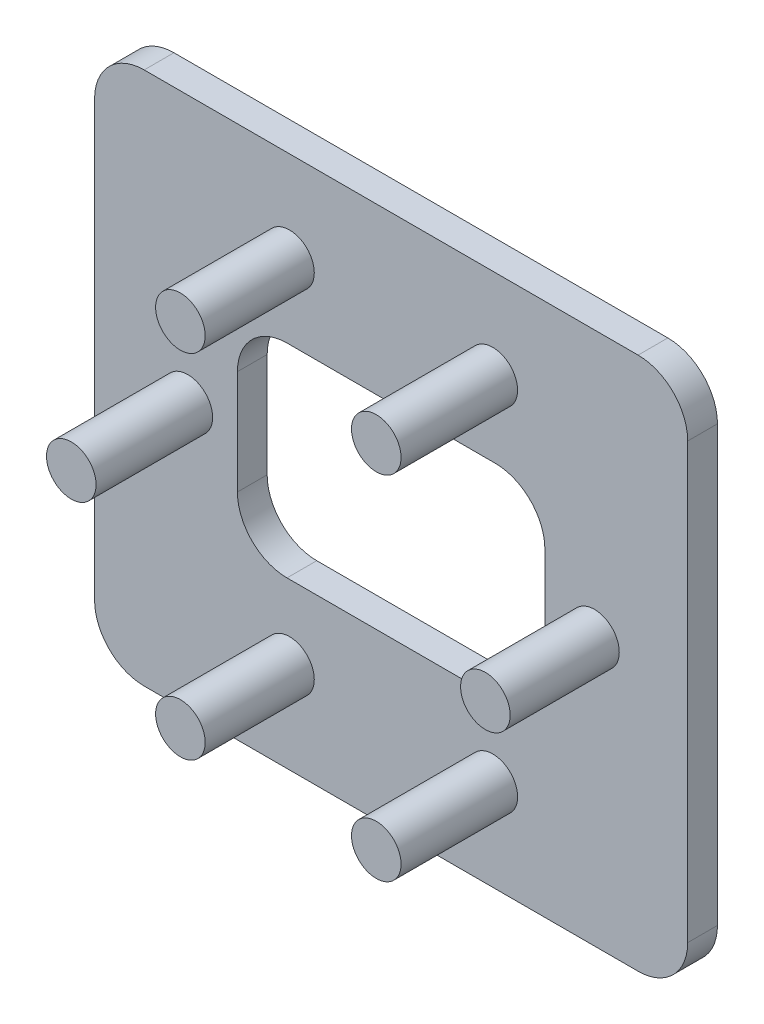
ISO-10303-21;
HEADER;
FILE_DESCRIPTION(('STEP AP214'),'2;1');
FILE_NAME('part.step','',(''),(''),'','','');
FILE_SCHEMA(('AUTOMOTIVE_DESIGN { 1 0 10303 214 1 1 1 1 }'));
ENDSEC;
DATA;
#1=APPLICATION_CONTEXT('core data for automotive mechanical design processes');
#2=APPLICATION_PROTOCOL_DEFINITION('international standard','automotive_design',2000,#1);
#3=PRODUCT_CONTEXT('',#1,'mechanical');
#4=PRODUCT('Part','Part','',(#3));
#5=PRODUCT_RELATED_PRODUCT_CATEGORY('part','',(#4));
#6=PRODUCT_DEFINITION_FORMATION('','',#4);
#7=PRODUCT_DEFINITION_CONTEXT('part definition',#1,'design');
#8=PRODUCT_DEFINITION('design','',#6,#7);
#9=PRODUCT_DEFINITION_SHAPE('','',#8);
#10=(LENGTH_UNIT() NAMED_UNIT(*) SI_UNIT(.MILLI.,.METRE.));
#11=(NAMED_UNIT(*) PLANE_ANGLE_UNIT() SI_UNIT($,.RADIAN.));
#12=(NAMED_UNIT(*) SI_UNIT($,.STERADIAN.) SOLID_ANGLE_UNIT());
#13=UNCERTAINTY_MEASURE_WITH_UNIT(LENGTH_MEASURE(1.E-05),#10,'distance_accuracy_value','');
#14=(GEOMETRIC_REPRESENTATION_CONTEXT(3) GLOBAL_UNCERTAINTY_ASSIGNED_CONTEXT((#13)) GLOBAL_UNIT_ASSIGNED_CONTEXT((#10,
#11,#12)) REPRESENTATION_CONTEXT('',''));
#15=CARTESIAN_POINT('',(0.,0.,0.));
#16=DIRECTION('',(0.,0.,1.));
#17=DIRECTION('',(1.,0.,0.));
#18=AXIS2_PLACEMENT_3D('',#15,#16,#17);
#19=CARTESIAN_POINT('',(-10.2500000000001,-17.7535207775809,14.));
#20=DIRECTION('',(0.,0.,-1.));
#21=DIRECTION('',(-1.,0.,0.));
#22=AXIS2_PLACEMENT_3D('',#19,#20,#21);
#23=CYLINDRICAL_SURFACE('',#22,2.5);
#24=CARTESIAN_POINT('',(-10.2500000000001,-17.7535207775809,14.));
#25=DIRECTION('',(0.,0.,1.));
#26=DIRECTION('',(1.,0.,0.));
#27=AXIS2_PLACEMENT_3D('',#24,#25,#26);
#28=CIRCLE('',#27,2.5);
#29=CARTESIAN_POINT('',(-7.75000000000009,-17.7535207775809,14.));
#30=VERTEX_POINT('',#29);
#31=EDGE_CURVE('E196',#30,#30,#28,.T.);
#32=ORIENTED_EDGE('',*,*,#31,.F.);
#33=EDGE_LOOP('',(#32));
#34=FACE_BOUND('',#33,.T.);
#35=CARTESIAN_POINT('',(-10.2500000000001,-17.7535207775809,0.));
#36=DIRECTION('',(0.,0.,1.));
#37=DIRECTION('',(1.,0.,0.));
#38=AXIS2_PLACEMENT_3D('',#35,#36,#37);
#39=CIRCLE('',#38,2.5);
#40=CARTESIAN_POINT('',(-7.75000000000009,-17.7535207775809,0.));
#41=VERTEX_POINT('',#40);
#42=EDGE_CURVE('E12',#41,#41,#39,.T.);
#43=ORIENTED_EDGE('',*,*,#42,.T.);
#44=EDGE_LOOP('',(#43));
#45=FACE_BOUND('',#44,.T.);
#46=ADVANCED_FACE('F192',(#34,#45),#23,.T.);
#47=CARTESIAN_POINT('',(-10.2500000000001,-17.7535207775809,14.));
#48=DIRECTION('',(0.,0.,1.));
#49=DIRECTION('',(1.,0.,0.));
#50=AXIS2_PLACEMENT_3D('',#47,#48,#49);
#51=PLANE('',#50);
#52=ORIENTED_EDGE('',*,*,#31,.T.);
#53=EDGE_LOOP('',(#52));
#54=FACE_BOUND('',#53,.T.);
#55=ADVANCED_FACE('F194',(#54),#51,.T.);
#56=CARTESIAN_POINT('',(-10.2500000000001,-17.7535207775809,0.));
#57=DIRECTION('',(0.,0.,1.));
#58=DIRECTION('',(1.,0.,0.));
#59=AXIS2_PLACEMENT_3D('',#56,#57,#58);
#60=PLANE('',#59);
#61=ORIENTED_EDGE('',*,*,#42,.F.);
#62=EDGE_LOOP('',(#61));
#63=FACE_BOUND('',#62,.T.);
#64=ADVANCED_FACE('F211',(#63),#60,.F.);
#65=CLOSED_SHELL('',(#46,#55,#64));
#66=MANIFOLD_SOLID_BREP('B2',#65);
#67=CARTESIAN_POINT('',(10.2500000000001,17.7535207775809,14.));
#68=DIRECTION('',(0.,0.,-1.));
#69=DIRECTION('',(-1.,0.,0.));
#70=AXIS2_PLACEMENT_3D('',#67,#68,#69);
#71=CYLINDRICAL_SURFACE('',#70,2.5);
#72=CARTESIAN_POINT('',(10.2500000000001,17.7535207775809,14.75));
#73=DIRECTION('',(0.,0.,1.));
#74=DIRECTION('',(1.,0.,0.));
#75=AXIS2_PLACEMENT_3D('',#72,#73,#74);
#76=CIRCLE('',#75,2.5);
#77=CARTESIAN_POINT('',(12.7500000000001,17.7535207775809,14.75));
#78=VERTEX_POINT('',#77);
#79=EDGE_CURVE('E254',#78,#78,#76,.T.);
#80=ORIENTED_EDGE('',*,*,#79,.F.);
#81=EDGE_LOOP('',(#80));
#82=FACE_BOUND('',#81,.T.);
#83=CARTESIAN_POINT('',(10.2500000000001,17.7535207775809,0.));
#84=DIRECTION('',(0.,0.,1.));
#85=DIRECTION('',(1.,0.,0.));
#86=AXIS2_PLACEMENT_3D('',#83,#84,#85);
#87=CIRCLE('',#86,2.5);
#88=CARTESIAN_POINT('',(12.7500000000001,17.7535207775809,0.));
#89=VERTEX_POINT('',#88);
#90=EDGE_CURVE('E191',#89,#89,#87,.T.);
#91=ORIENTED_EDGE('',*,*,#90,.T.);
#92=EDGE_LOOP('',(#91));
#93=FACE_BOUND('',#92,.T.);
#94=ADVANCED_FACE('F247',(#82,#93),#71,.T.);
#95=CARTESIAN_POINT('',(10.2500000000001,17.7535207775809,0.));
#96=DIRECTION('',(0.,0.,1.));
#97=DIRECTION('',(1.,0.,0.));
#98=AXIS2_PLACEMENT_3D('',#95,#96,#97);
#99=PLANE('',#98);
#100=ORIENTED_EDGE('',*,*,#90,.F.);
#101=EDGE_LOOP('',(#100));
#102=FACE_BOUND('',#101,.T.);
#103=ADVANCED_FACE('F249',(#102),#99,.F.);
#104=CARTESIAN_POINT('',(10.2500000000001,17.7535207775809,14.75));
#105=DIRECTION('',(0.,0.,1.));
#106=DIRECTION('',(1.,0.,0.));
#107=AXIS2_PLACEMENT_3D('',#104,#105,#106);
#108=PLANE('',#107);
#109=ORIENTED_EDGE('',*,*,#79,.T.);
#110=EDGE_LOOP('',(#109));
#111=FACE_BOUND('',#110,.T.);
#112=ADVANCED_FACE('F260',(#111),#108,.T.);
#113=CLOSED_SHELL('',(#94,#103,#112));
#114=MANIFOLD_SOLID_BREP('B7',#113);
#115=CARTESIAN_POINT('',(-10.2499999999998,17.7535207775811,14.));
#116=DIRECTION('',(0.,0.,-1.));
#117=DIRECTION('',(-1.,0.,0.));
#118=AXIS2_PLACEMENT_3D('',#115,#116,#117);
#119=CYLINDRICAL_SURFACE('',#118,2.5);
#120=CARTESIAN_POINT('',(-10.2499999999998,17.7535207775811,14.));
#121=DIRECTION('',(0.,0.,1.));
#122=DIRECTION('',(1.,0.,0.));
#123=AXIS2_PLACEMENT_3D('',#120,#121,#122);
#124=CIRCLE('',#123,2.5);
#125=CARTESIAN_POINT('',(-7.74999999999984,17.7535207775811,14.));
#126=VERTEX_POINT('',#125);
#127=EDGE_CURVE('E309',#126,#126,#124,.T.);
#128=ORIENTED_EDGE('',*,*,#127,.F.);
#129=EDGE_LOOP('',(#128));
#130=FACE_BOUND('',#129,.T.);
#131=CARTESIAN_POINT('',(-10.2499999999998,17.7535207775811,0.));
#132=DIRECTION('',(0.,0.,1.));
#133=DIRECTION('',(1.,0.,0.));
#134=AXIS2_PLACEMENT_3D('',#131,#132,#133);
#135=CIRCLE('',#134,2.5);
#136=CARTESIAN_POINT('',(-7.74999999999984,17.7535207775811,0.));
#137=VERTEX_POINT('',#136);
#138=EDGE_CURVE('E246',#137,#137,#135,.T.);
#139=ORIENTED_EDGE('',*,*,#138,.T.);
#140=EDGE_LOOP('',(#139));
#141=FACE_BOUND('',#140,.T.);
#142=ADVANCED_FACE('F305',(#130,#141),#119,.T.);
#143=CARTESIAN_POINT('',(-10.2499999999998,17.7535207775811,14.));
#144=DIRECTION('',(0.,0.,1.));
#145=DIRECTION('',(1.,0.,0.));
#146=AXIS2_PLACEMENT_3D('',#143,#144,#145);
#147=PLANE('',#146);
#148=ORIENTED_EDGE('',*,*,#127,.T.);
#149=EDGE_LOOP('',(#148));
#150=FACE_BOUND('',#149,.T.);
#151=ADVANCED_FACE('F307',(#150),#147,.T.);
#152=CARTESIAN_POINT('',(-10.2499999999998,17.7535207775811,0.));
#153=DIRECTION('',(0.,0.,1.));
#154=DIRECTION('',(1.,0.,0.));
#155=AXIS2_PLACEMENT_3D('',#152,#153,#154);
#156=PLANE('',#155);
#157=ORIENTED_EDGE('',*,*,#138,.F.);
#158=EDGE_LOOP('',(#157));
#159=FACE_BOUND('',#158,.T.);
#160=ADVANCED_FACE('F324',(#159),#156,.F.);
#161=CLOSED_SHELL('',(#142,#151,#160));
#162=MANIFOLD_SOLID_BREP('B186',#161);
#163=CARTESIAN_POINT('',(20.5,0.,14.));
#164=DIRECTION('',(0.,0.,-1.));
#165=DIRECTION('',(-1.,0.,0.));
#166=AXIS2_PLACEMENT_3D('',#163,#164,#165);
#167=CYLINDRICAL_SURFACE('',#166,2.5);
#168=CARTESIAN_POINT('',(20.5,0.,14.));
#169=DIRECTION('',(0.,0.,1.));
#170=DIRECTION('',(1.,0.,0.));
#171=AXIS2_PLACEMENT_3D('',#168,#169,#170);
#172=CIRCLE('',#171,2.5);
#173=CARTESIAN_POINT('',(23.,0.,14.));
#174=VERTEX_POINT('',#173);
#175=EDGE_CURVE('E364',#174,#174,#172,.T.);
#176=ORIENTED_EDGE('',*,*,#175,.F.);
#177=EDGE_LOOP('',(#176));
#178=FACE_BOUND('',#177,.T.);
#179=CARTESIAN_POINT('',(20.5,0.,0.));
#180=DIRECTION('',(0.,0.,1.));
#181=DIRECTION('',(1.,0.,0.));
#182=AXIS2_PLACEMENT_3D('',#179,#180,#181);
#183=CIRCLE('',#182,2.5);
#184=CARTESIAN_POINT('',(23.,0.,0.));
#185=VERTEX_POINT('',#184);
#186=EDGE_CURVE('E304',#185,#185,#183,.T.);
#187=ORIENTED_EDGE('',*,*,#186,.T.);
#188=EDGE_LOOP('',(#187));
#189=FACE_BOUND('',#188,.T.);
#190=ADVANCED_FACE('F360',(#178,#189),#167,.T.);
#191=CARTESIAN_POINT('',(0.,0.,14.));
#192=DIRECTION('',(0.,0.,1.));
#193=DIRECTION('',(1.,0.,0.));
#194=AXIS2_PLACEMENT_3D('',#191,#192,#193);
#195=PLANE('',#194);
#196=ORIENTED_EDGE('',*,*,#175,.T.);
#197=EDGE_LOOP('',(#196));
#198=FACE_BOUND('',#197,.T.);
#199=ADVANCED_FACE('F362',(#198),#195,.T.);
#200=CARTESIAN_POINT('',(0.,0.,0.));
#201=DIRECTION('',(0.,0.,1.));
#202=DIRECTION('',(1.,0.,0.));
#203=AXIS2_PLACEMENT_3D('',#200,#201,#202);
#204=PLANE('',#203);
#205=ORIENTED_EDGE('',*,*,#186,.F.);
#206=EDGE_LOOP('',(#205));
#207=FACE_BOUND('',#206,.T.);
#208=ADVANCED_FACE('F379',(#207),#204,.F.);
#209=CLOSED_SHELL('',(#190,#199,#208));
#210=MANIFOLD_SOLID_BREP('B241',#209);
#211=CARTESIAN_POINT('',(10.25,-17.7535207775811,14.));
#212=DIRECTION('',(0.,0.,-1.));
#213=DIRECTION('',(-1.,0.,0.));
#214=AXIS2_PLACEMENT_3D('',#211,#212,#213);
#215=CYLINDRICAL_SURFACE('',#214,2.50000000000007);
#216=CARTESIAN_POINT('',(10.25,-17.7535207775811,14.75));
#217=DIRECTION('',(0.,0.,1.));
#218=DIRECTION('',(1.,0.,0.));
#219=AXIS2_PLACEMENT_3D('',#216,#217,#218);
#220=CIRCLE('',#219,2.50000000000008);
#221=CARTESIAN_POINT('',(12.75,-17.7535207775811,14.75));
#222=VERTEX_POINT('',#221);
#223=EDGE_CURVE('E422',#222,#222,#220,.T.);
#224=ORIENTED_EDGE('',*,*,#223,.F.);
#225=EDGE_LOOP('',(#224));
#226=FACE_BOUND('',#225,.T.);
#227=CARTESIAN_POINT('',(10.25,-17.7535207775811,0.));
#228=DIRECTION('',(0.,0.,1.));
#229=DIRECTION('',(1.,0.,0.));
#230=AXIS2_PLACEMENT_3D('',#227,#228,#229);
#231=CIRCLE('',#230,2.50000000000007);
#232=CARTESIAN_POINT('',(12.75,-17.7535207775811,0.));
#233=VERTEX_POINT('',#232);
#234=EDGE_CURVE('E359',#233,#233,#231,.T.);
#235=ORIENTED_EDGE('',*,*,#234,.T.);
#236=EDGE_LOOP('',(#235));
#237=FACE_BOUND('',#236,.T.);
#238=ADVANCED_FACE('F415',(#226,#237),#215,.T.);
#239=CARTESIAN_POINT('',(0.,0.,0.));
#240=DIRECTION('',(0.,0.,1.));
#241=DIRECTION('',(1.,0.,0.));
#242=AXIS2_PLACEMENT_3D('',#239,#240,#241);
#243=PLANE('',#242);
#244=ORIENTED_EDGE('',*,*,#234,.F.);
#245=EDGE_LOOP('',(#244));
#246=FACE_BOUND('',#245,.T.);
#247=ADVANCED_FACE('F417',(#246),#243,.F.);
#248=CARTESIAN_POINT('',(10.25,-17.7535207775811,14.75));
#249=DIRECTION('',(0.,0.,1.));
#250=DIRECTION('',(1.,0.,0.));
#251=AXIS2_PLACEMENT_3D('',#248,#249,#250);
#252=PLANE('',#251);
#253=ORIENTED_EDGE('',*,*,#223,.T.);
#254=EDGE_LOOP('',(#253));
#255=FACE_BOUND('',#254,.T.);
#256=ADVANCED_FACE('F428',(#255),#252,.T.);
#257=CLOSED_SHELL('',(#238,#247,#256));
#258=MANIFOLD_SOLID_BREP('B299',#257);
#259=CARTESIAN_POINT('',(-20.5,0.,14.));
#260=DIRECTION('',(0.,0.,-1.));
#261=DIRECTION('',(-1.,0.,0.));
#262=AXIS2_PLACEMENT_3D('',#259,#260,#261);
#263=CYLINDRICAL_SURFACE('',#262,2.5);
#264=CARTESIAN_POINT('',(-20.5,0.,14.75));
#265=DIRECTION('',(0.,0.,1.));
#266=DIRECTION('',(1.,0.,0.));
#267=AXIS2_PLACEMENT_3D('',#264,#265,#266);
#268=CIRCLE('',#267,2.5);
#269=CARTESIAN_POINT('',(-18.,0.,14.75));
#270=VERTEX_POINT('',#269);
#271=EDGE_CURVE('E480',#270,#270,#268,.T.);
#272=ORIENTED_EDGE('',*,*,#271,.F.);
#273=EDGE_LOOP('',(#272));
#274=FACE_BOUND('',#273,.T.);
#275=CARTESIAN_POINT('',(-20.5,0.,0.));
#276=DIRECTION('',(0.,0.,1.));
#277=DIRECTION('',(1.,0.,0.));
#278=AXIS2_PLACEMENT_3D('',#275,#276,#277);
#279=CIRCLE('',#278,2.5);
#280=CARTESIAN_POINT('',(-18.,0.,0.));
#281=VERTEX_POINT('',#280);
#282=EDGE_CURVE('E414',#281,#281,#279,.T.);
#283=ORIENTED_EDGE('',*,*,#282,.T.);
#284=EDGE_LOOP('',(#283));
#285=FACE_BOUND('',#284,.T.);
#286=ADVANCED_FACE('F474',(#274,#285),#263,.T.);
#287=CARTESIAN_POINT('',(0.,0.,0.));
#288=DIRECTION('',(0.,0.,1.));
#289=DIRECTION('',(1.,0.,0.));
#290=AXIS2_PLACEMENT_3D('',#287,#288,#289);
#291=PLANE('',#290);
#292=ORIENTED_EDGE('',*,*,#282,.F.);
#293=EDGE_LOOP('',(#292));
#294=FACE_BOUND('',#293,.T.);
#295=ADVANCED_FACE('F489',(#294),#291,.F.);
#296=CARTESIAN_POINT('',(-20.5,0.,14.75));
#297=DIRECTION('',(0.,0.,1.));
#298=DIRECTION('',(1.,0.,0.));
#299=AXIS2_PLACEMENT_3D('',#296,#297,#298);
#300=PLANE('',#299);
#301=ORIENTED_EDGE('',*,*,#271,.T.);
#302=EDGE_LOOP('',(#301));
#303=FACE_BOUND('',#302,.T.);
#304=ADVANCED_FACE('F486',(#303),#300,.T.);
#305=CLOSED_SHELL('',(#286,#295,#304));
#306=MANIFOLD_SOLID_BREP('B354',#305);
#307=CARTESIAN_POINT('',(-29.9,-26.9,3.));
#308=DIRECTION('',(0.,1.,0.));
#309=DIRECTION('',(0.,0.,1.));
#310=AXIS2_PLACEMENT_3D('',#307,#308,#309);
#311=PLANE('',#310);
#312=DIRECTION('',(0.,0.,-1.));
#313=VECTOR('',#312,1.);
#314=CARTESIAN_POINT('',(24.9,-26.9,14.75));
#315=LINE('',#314,#313);
#316=CARTESIAN_POINT('',(24.9,-26.9,3.));
#317=VERTEX_POINT('',#316);
#318=CARTESIAN_POINT('',(24.9,-26.9,0.));
#319=VERTEX_POINT('',#318);
#320=EDGE_CURVE('E637',#317,#319,#315,.T.);
#321=ORIENTED_EDGE('',*,*,#320,.F.);
#322=DIRECTION('',(1.,0.,0.));
#323=VECTOR('',#322,1.);
#324=CARTESIAN_POINT('',(-29.9,-26.9,3.));
#325=LINE('',#324,#323);
#326=CARTESIAN_POINT('',(-24.9,-26.9,3.));
#327=VERTEX_POINT('',#326);
#328=EDGE_CURVE('E665',#327,#317,#325,.T.);
#329=ORIENTED_EDGE('',*,*,#328,.F.);
#330=DIRECTION('',(0.,0.,-1.));
#331=VECTOR('',#330,1.);
#332=CARTESIAN_POINT('',(-24.9,-26.9,14.75));
#333=LINE('',#332,#331);
#334=CARTESIAN_POINT('',(-24.9,-26.9,0.));
#335=VERTEX_POINT('',#334);
#336=EDGE_CURVE('E662',#335,#327,#333,.F.);
#337=ORIENTED_EDGE('',*,*,#336,.F.);
#338=DIRECTION('',(1.,0.,0.));
#339=VECTOR('',#338,1.);
#340=CARTESIAN_POINT('',(-29.9,-26.9,0.));
#341=LINE('',#340,#339);
#342=EDGE_CURVE('E656',#335,#319,#341,.T.);
#343=ORIENTED_EDGE('',*,*,#342,.T.);
#344=EDGE_LOOP('',(#321,#329,#337,#343));
#345=FACE_BOUND('',#344,.T.);
#346=ADVANCED_FACE('F524',(#345),#311,.F.);
#347=CARTESIAN_POINT('',(10.5,5.25352077758109,3.));
#348=DIRECTION('',(0.,0.,-1.));
#349=DIRECTION('',(-1.,0.,0.));
#350=AXIS2_PLACEMENT_3D('',#347,#348,#349);
#351=CYLINDRICAL_SURFACE('',#350,5.);
#352=CARTESIAN_POINT('',(10.5,5.25352077758109,0.));
#353=DIRECTION('',(0.,0.,1.));
#354=DIRECTION('',(1.,0.,0.));
#355=AXIS2_PLACEMENT_3D('',#352,#353,#354);
#356=CIRCLE('',#355,5.);
#357=CARTESIAN_POINT('',(10.5,10.2535207775811,0.));
#358=VERTEX_POINT('',#357);
#359=CARTESIAN_POINT('',(15.5,5.25352077758109,0.));
#360=VERTEX_POINT('',#359);
#361=EDGE_CURVE('E749',#358,#360,#356,.F.);
#362=ORIENTED_EDGE('',*,*,#361,.T.);
#363=DIRECTION('',(0.,0.,-1.));
#364=VECTOR('',#363,1.);
#365=CARTESIAN_POINT('',(15.5,5.25352077758109,3.));
#366=LINE('',#365,#364);
#367=CARTESIAN_POINT('',(15.5,5.25352077758109,3.));
#368=VERTEX_POINT('',#367);
#369=EDGE_CURVE('E779',#368,#360,#366,.T.);
#370=ORIENTED_EDGE('',*,*,#369,.F.);
#371=CARTESIAN_POINT('',(10.5,5.25352077758109,3.));
#372=DIRECTION('',(0.,0.,1.));
#373=DIRECTION('',(1.,0.,0.));
#374=AXIS2_PLACEMENT_3D('',#371,#372,#373);
#375=CIRCLE('',#374,5.);
#376=CARTESIAN_POINT('',(10.5,10.2535207775811,3.));
#377=VERTEX_POINT('',#376);
#378=EDGE_CURVE('E717',#377,#368,#375,.F.);
#379=ORIENTED_EDGE('',*,*,#378,.F.);
#380=DIRECTION('',(0.,0.,-1.));
#381=VECTOR('',#380,1.);
#382=CARTESIAN_POINT('',(10.5,10.2535207775811,3.));
#383=LINE('',#382,#381);
#384=EDGE_CURVE('E675',#377,#358,#383,.T.);
#385=ORIENTED_EDGE('',*,*,#384,.T.);
#386=EDGE_LOOP('',(#362,#370,#379,#385));
#387=FACE_BOUND('',#386,.T.);
#388=ADVANCED_FACE('F810',(#387),#351,.F.);
#389=CARTESIAN_POINT('',(15.5,0.,3.));
#390=DIRECTION('',(1.,0.,0.));
#391=DIRECTION('',(0.,0.,-1.));
#392=AXIS2_PLACEMENT_3D('',#389,#390,#391);
#393=PLANE('',#392);
#394=DIRECTION('',(0.,-1.,0.));
#395=VECTOR('',#394,1.);
#396=CARTESIAN_POINT('',(15.5,0.,0.));
#397=LINE('',#396,#395);
#398=CARTESIAN_POINT('',(15.5,-5.25352077758109,0.));
#399=VERTEX_POINT('',#398);
#400=EDGE_CURVE('E751',#360,#399,#397,.T.);
#401=ORIENTED_EDGE('',*,*,#400,.T.);
#402=DIRECTION('',(0.,0.,-1.));
#403=VECTOR('',#402,1.);
#404=CARTESIAN_POINT('',(15.5,-5.25352077758109,3.));
#405=LINE('',#404,#403);
#406=CARTESIAN_POINT('',(15.5,-5.25352077758109,3.));
#407=VERTEX_POINT('',#406);
#408=EDGE_CURVE('E777',#407,#399,#405,.T.);
#409=ORIENTED_EDGE('',*,*,#408,.F.);
#410=DIRECTION('',(0.,-1.,0.));
#411=VECTOR('',#410,1.);
#412=CARTESIAN_POINT('',(15.5,0.,3.));
#413=LINE('',#412,#411);
#414=EDGE_CURVE('E719',#368,#407,#413,.T.);
#415=ORIENTED_EDGE('',*,*,#414,.F.);
#416=ORIENTED_EDGE('',*,*,#369,.T.);
#417=EDGE_LOOP('',(#401,#409,#415,#416));
#418=FACE_BOUND('',#417,.T.);
#419=ADVANCED_FACE('F814',(#418),#393,.F.);
#420=CARTESIAN_POINT('',(10.5,-5.25352077758109,3.));
#421=DIRECTION('',(0.,0.,-1.));
#422=DIRECTION('',(-1.,0.,0.));
#423=AXIS2_PLACEMENT_3D('',#420,#421,#422);
#424=CYLINDRICAL_SURFACE('',#423,5.);
#425=CARTESIAN_POINT('',(10.5,-5.25352077758109,0.));
#426=DIRECTION('',(0.,0.,1.));
#427=DIRECTION('',(1.,0.,0.));
#428=AXIS2_PLACEMENT_3D('',#425,#426,#427);
#429=CIRCLE('',#428,5.);
#430=CARTESIAN_POINT('',(10.5,-10.2535207775811,0.));
#431=VERTEX_POINT('',#430);
#432=EDGE_CURVE('E754',#431,#399,#429,.T.);
#433=ORIENTED_EDGE('',*,*,#432,.F.);
#434=DIRECTION('',(0.,0.,-1.));
#435=VECTOR('',#434,1.);
#436=CARTESIAN_POINT('',(10.5,-10.2535207775811,3.));
#437=LINE('',#436,#435);
#438=CARTESIAN_POINT('',(10.5,-10.2535207775811,3.));
#439=VERTEX_POINT('',#438);
#440=EDGE_CURVE('E775',#439,#431,#437,.T.);
#441=ORIENTED_EDGE('',*,*,#440,.F.);
#442=CARTESIAN_POINT('',(10.5,-5.25352077758109,3.));
#443=DIRECTION('',(0.,0.,1.));
#444=DIRECTION('',(1.,0.,0.));
#445=AXIS2_PLACEMENT_3D('',#442,#443,#444);
#446=CIRCLE('',#445,5.);
#447=EDGE_CURVE('E721',#439,#407,#446,.T.);
#448=ORIENTED_EDGE('',*,*,#447,.T.);
#449=ORIENTED_EDGE('',*,*,#408,.T.);
#450=EDGE_LOOP('',(#433,#441,#448,#449));
#451=FACE_BOUND('',#450,.T.);
#452=ADVANCED_FACE('F844',(#451),#424,.F.);
#453=CARTESIAN_POINT('',(0.,-10.2535207775811,3.));
#454=DIRECTION('',(0.,1.,0.));
#455=DIRECTION('',(0.,0.,1.));
#456=AXIS2_PLACEMENT_3D('',#453,#454,#455);
#457=PLANE('',#456);
#458=DIRECTION('',(1.,0.,0.));
#459=VECTOR('',#458,1.);
#460=CARTESIAN_POINT('',(0.,-10.2535207775811,0.));
#461=LINE('',#460,#459);
#462=CARTESIAN_POINT('',(-10.5,-10.2535207775811,0.));
#463=VERTEX_POINT('',#462);
#464=EDGE_CURVE('E757',#463,#431,#461,.T.);
#465=ORIENTED_EDGE('',*,*,#464,.F.);
#466=DIRECTION('',(0.,0.,-1.));
#467=VECTOR('',#466,1.);
#468=CARTESIAN_POINT('',(-10.5,-10.2535207775811,3.));
#469=LINE('',#468,#467);
#470=CARTESIAN_POINT('',(-10.5,-10.2535207775811,3.));
#471=VERTEX_POINT('',#470);
#472=EDGE_CURVE('E773',#471,#463,#469,.T.);
#473=ORIENTED_EDGE('',*,*,#472,.F.);
#474=DIRECTION('',(1.,0.,0.));
#475=VECTOR('',#474,1.);
#476=CARTESIAN_POINT('',(0.,-10.2535207775811,3.));
#477=LINE('',#476,#475);
#478=EDGE_CURVE('E724',#471,#439,#477,.T.);
#479=ORIENTED_EDGE('',*,*,#478,.T.);
#480=ORIENTED_EDGE('',*,*,#440,.T.);
#481=EDGE_LOOP('',(#465,#473,#479,#480));
#482=FACE_BOUND('',#481,.T.);
#483=ADVANCED_FACE('F848',(#482),#457,.T.);
#484=CARTESIAN_POINT('',(-10.5,-5.25352077758109,3.));
#485=DIRECTION('',(0.,0.,-1.));
#486=DIRECTION('',(-1.,0.,0.));
#487=AXIS2_PLACEMENT_3D('',#484,#485,#486);
#488=CYLINDRICAL_SURFACE('',#487,5.);
#489=CARTESIAN_POINT('',(-10.5,-5.25352077758109,0.));
#490=DIRECTION('',(0.,0.,1.));
#491=DIRECTION('',(1.,0.,0.));
#492=AXIS2_PLACEMENT_3D('',#489,#490,#491);
#493=CIRCLE('',#492,5.);
#494=CARTESIAN_POINT('',(-15.5,-5.25352077758109,0.));
#495=VERTEX_POINT('',#494);
#496=EDGE_CURVE('E760',#495,#463,#493,.T.);
#497=ORIENTED_EDGE('',*,*,#496,.F.);
#498=DIRECTION('',(0.,0.,-1.));
#499=VECTOR('',#498,1.);
#500=CARTESIAN_POINT('',(-15.5,-5.25352077758109,3.));
#501=LINE('',#500,#499);
#502=CARTESIAN_POINT('',(-15.5,-5.25352077758109,3.));
#503=VERTEX_POINT('',#502);
#504=EDGE_CURVE('E771',#503,#495,#501,.T.);
#505=ORIENTED_EDGE('',*,*,#504,.F.);
#506=CARTESIAN_POINT('',(-10.5,-5.25352077758109,3.));
#507=DIRECTION('',(0.,0.,1.));
#508=DIRECTION('',(1.,0.,0.));
#509=AXIS2_PLACEMENT_3D('',#506,#507,#508);
#510=CIRCLE('',#509,5.);
#511=EDGE_CURVE('E727',#503,#471,#510,.T.);
#512=ORIENTED_EDGE('',*,*,#511,.T.);
#513=ORIENTED_EDGE('',*,*,#472,.T.);
#514=EDGE_LOOP('',(#497,#505,#512,#513));
#515=FACE_BOUND('',#514,.T.);
#516=ADVANCED_FACE('F852',(#515),#488,.F.);
#517=CARTESIAN_POINT('',(-15.5,0.,3.));
#518=DIRECTION('',(1.,0.,0.));
#519=DIRECTION('',(0.,0.,-1.));
#520=AXIS2_PLACEMENT_3D('',#517,#518,#519);
#521=PLANE('',#520);
#522=DIRECTION('',(0.,-1.,0.));
#523=VECTOR('',#522,1.);
#524=CARTESIAN_POINT('',(-15.5,0.,0.));
#525=LINE('',#524,#523);
#526=CARTESIAN_POINT('',(-15.5,5.25352077758109,0.));
#527=VERTEX_POINT('',#526);
#528=EDGE_CURVE('E763',#527,#495,#525,.T.);
#529=ORIENTED_EDGE('',*,*,#528,.F.);
#530=DIRECTION('',(0.,0.,-1.));
#531=VECTOR('',#530,1.);
#532=CARTESIAN_POINT('',(-15.5,5.25352077758109,3.));
#533=LINE('',#532,#531);
#534=CARTESIAN_POINT('',(-15.5,5.25352077758109,3.));
#535=VERTEX_POINT('',#534);
#536=EDGE_CURVE('E769',#535,#527,#533,.T.);
#537=ORIENTED_EDGE('',*,*,#536,.F.);
#538=DIRECTION('',(0.,-1.,0.));
#539=VECTOR('',#538,1.);
#540=CARTESIAN_POINT('',(-15.5,0.,3.));
#541=LINE('',#540,#539);
#542=EDGE_CURVE('E730',#535,#503,#541,.T.);
#543=ORIENTED_EDGE('',*,*,#542,.T.);
#544=ORIENTED_EDGE('',*,*,#504,.T.);
#545=EDGE_LOOP('',(#529,#537,#543,#544));
#546=FACE_BOUND('',#545,.T.);
#547=ADVANCED_FACE('F856',(#546),#521,.T.);
#548=CARTESIAN_POINT('',(-10.5,5.25352077758109,3.));
#549=DIRECTION('',(0.,0.,-1.));
#550=DIRECTION('',(-1.,0.,0.));
#551=AXIS2_PLACEMENT_3D('',#548,#549,#550);
#552=CYLINDRICAL_SURFACE('',#551,5.);
#553=CARTESIAN_POINT('',(-10.5,5.25352077758109,0.));
#554=DIRECTION('',(0.,0.,1.));
#555=DIRECTION('',(1.,0.,0.));
#556=AXIS2_PLACEMENT_3D('',#553,#554,#555);
#557=CIRCLE('',#556,5.);
#558=CARTESIAN_POINT('',(-10.5,10.2535207775811,0.));
#559=VERTEX_POINT('',#558);
#560=EDGE_CURVE('E708',#559,#527,#557,.T.);
#561=ORIENTED_EDGE('',*,*,#560,.F.);
#562=DIRECTION('',(0.,0.,-1.));
#563=VECTOR('',#562,1.);
#564=CARTESIAN_POINT('',(-10.5,10.2535207775811,3.));
#565=LINE('',#564,#563);
#566=CARTESIAN_POINT('',(-10.5,10.2535207775811,3.));
#567=VERTEX_POINT('',#566);
#568=EDGE_CURVE('E736',#567,#559,#565,.T.);
#569=ORIENTED_EDGE('',*,*,#568,.F.);
#570=CARTESIAN_POINT('',(-10.5,5.25352077758109,3.));
#571=DIRECTION('',(0.,0.,1.));
#572=DIRECTION('',(1.,0.,0.));
#573=AXIS2_PLACEMENT_3D('',#570,#571,#572);
#574=CIRCLE('',#573,5.);
#575=EDGE_CURVE('E733',#567,#535,#574,.T.);
#576=ORIENTED_EDGE('',*,*,#575,.T.);
#577=ORIENTED_EDGE('',*,*,#536,.T.);
#578=EDGE_LOOP('',(#561,#569,#576,#577));
#579=FACE_BOUND('',#578,.T.);
#580=ADVANCED_FACE('F839',(#579),#552,.F.);
#581=CARTESIAN_POINT('',(0.,10.2535207775811,3.));
#582=DIRECTION('',(0.,1.,0.));
#583=DIRECTION('',(0.,0.,1.));
#584=AXIS2_PLACEMENT_3D('',#581,#582,#583);
#585=PLANE('',#584);
#586=DIRECTION('',(1.,0.,0.));
#587=VECTOR('',#586,1.);
#588=CARTESIAN_POINT('',(0.,10.2535207775811,0.));
#589=LINE('',#588,#587);
#590=EDGE_CURVE('E746',#559,#358,#589,.T.);
#591=ORIENTED_EDGE('',*,*,#590,.T.);
#592=ORIENTED_EDGE('',*,*,#384,.F.);
#593=DIRECTION('',(1.,0.,0.));
#594=VECTOR('',#593,1.);
#595=CARTESIAN_POINT('',(0.,10.2535207775811,3.));
#596=LINE('',#595,#594);
#597=EDGE_CURVE('E714',#567,#377,#596,.T.);
#598=ORIENTED_EDGE('',*,*,#597,.F.);
#599=ORIENTED_EDGE('',*,*,#568,.T.);
#600=EDGE_LOOP('',(#591,#592,#598,#599));
#601=FACE_BOUND('',#600,.T.);
#602=ADVANCED_FACE('F836',(#601),#585,.F.);
#603=CARTESIAN_POINT('',(10.2500000000001,17.7535207775809,3.));
#604=DIRECTION('',(0.,0.,-1.));
#605=DIRECTION('',(-1.,0.,0.));
#606=AXIS2_PLACEMENT_3D('',#603,#604,#605);
#607=CYLINDRICAL_SURFACE('',#606,2.5);
#608=CARTESIAN_POINT('',(10.2500000000001,17.7535207775809,3.));
#609=DIRECTION('',(0.,0.,1.));
#610=DIRECTION('',(1.,0.,0.));
#611=AXIS2_PLACEMENT_3D('',#608,#609,#610);
#612=CIRCLE('',#611,2.5);
#613=CARTESIAN_POINT('',(12.7500000000001,17.7535207775809,3.));
#614=VERTEX_POINT('',#613);
#615=EDGE_CURVE('E711',#614,#614,#612,.T.);
#616=ORIENTED_EDGE('',*,*,#615,.T.);
#617=EDGE_LOOP('',(#616));
#618=FACE_BOUND('',#617,.T.);
#619=CARTESIAN_POINT('',(10.2500000000001,17.7535207775809,0.));
#620=DIRECTION('',(0.,0.,1.));
#621=DIRECTION('',(1.,0.,0.));
#622=AXIS2_PLACEMENT_3D('',#619,#620,#621);
#623=CIRCLE('',#622,2.5);
#624=CARTESIAN_POINT('',(12.7500000000001,17.7535207775809,0.));
#625=VERTEX_POINT('',#624);
#626=EDGE_CURVE('E743',#625,#625,#623,.T.);
#627=ORIENTED_EDGE('',*,*,#626,.F.);
#628=EDGE_LOOP('',(#627));
#629=FACE_BOUND('',#628,.T.);
#630=ADVANCED_FACE('F832',(#618,#629),#607,.F.);
#631=CARTESIAN_POINT('',(-10.2500000000001,-17.7535207775809,3.));
#632=DIRECTION('',(0.,0.,-1.));
#633=DIRECTION('',(-1.,0.,0.));
#634=AXIS2_PLACEMENT_3D('',#631,#632,#633);
#635=CYLINDRICAL_SURFACE('',#634,2.5);
#636=CARTESIAN_POINT('',(-10.2500000000001,-17.7535207775809,3.));
#637=DIRECTION('',(0.,0.,1.));
#638=DIRECTION('',(1.,0.,0.));
#639=AXIS2_PLACEMENT_3D('',#636,#637,#638);
#640=CIRCLE('',#639,2.5);
#641=CARTESIAN_POINT('',(-7.75000000000009,-17.7535207775809,3.));
#642=VERTEX_POINT('',#641);
#643=EDGE_CURVE('E707',#642,#642,#640,.T.);
#644=ORIENTED_EDGE('',*,*,#643,.T.);
#645=EDGE_LOOP('',(#644));
#646=FACE_BOUND('',#645,.T.);
#647=CARTESIAN_POINT('',(-10.2500000000001,-17.7535207775809,0.));
#648=DIRECTION('',(0.,0.,1.));
#649=DIRECTION('',(1.,0.,0.));
#650=AXIS2_PLACEMENT_3D('',#647,#648,#649);
#651=CIRCLE('',#650,2.5);
#652=CARTESIAN_POINT('',(-7.75000000000009,-17.7535207775809,0.));
#653=VERTEX_POINT('',#652);
#654=EDGE_CURVE('E740',#653,#653,#651,.T.);
#655=ORIENTED_EDGE('',*,*,#654,.F.);
#656=EDGE_LOOP('',(#655));
#657=FACE_BOUND('',#656,.T.);
#658=ADVANCED_FACE('F828',(#646,#657),#635,.F.);
#659=CARTESIAN_POINT('',(-10.2499999999998,17.7535207775811,3.));
#660=DIRECTION('',(0.,0.,-1.));
#661=DIRECTION('',(-1.,0.,0.));
#662=AXIS2_PLACEMENT_3D('',#659,#660,#661);
#663=CYLINDRICAL_SURFACE('',#662,2.5);
#664=CARTESIAN_POINT('',(-10.2499999999998,17.7535207775811,3.));
#665=DIRECTION('',(0.,0.,1.));
#666=DIRECTION('',(1.,0.,0.));
#667=AXIS2_PLACEMENT_3D('',#664,#665,#666);
#668=CIRCLE('',#667,2.5);
#669=CARTESIAN_POINT('',(-7.74999999999984,17.7535207775811,3.));
#670=VERTEX_POINT('',#669);
#671=EDGE_CURVE('E704',#670,#670,#668,.T.);
#672=ORIENTED_EDGE('',*,*,#671,.T.);
#673=EDGE_LOOP('',(#672));
#674=FACE_BOUND('',#673,.T.);
#675=CARTESIAN_POINT('',(-10.2499999999998,17.7535207775811,0.));
#676=DIRECTION('',(0.,0.,1.));
#677=DIRECTION('',(1.,0.,0.));
#678=AXIS2_PLACEMENT_3D('',#675,#676,#677);
#679=CIRCLE('',#678,2.5);
#680=CARTESIAN_POINT('',(-7.74999999999984,17.7535207775811,0.));
#681=VERTEX_POINT('',#680);
#682=EDGE_CURVE('E737',#681,#681,#679,.T.);
#683=ORIENTED_EDGE('',*,*,#682,.F.);
#684=EDGE_LOOP('',(#683));
#685=FACE_BOUND('',#684,.T.);
#686=ADVANCED_FACE('F825',(#674,#685),#663,.F.);
#687=CARTESIAN_POINT('',(0.,0.,0.));
#688=DIRECTION('',(0.,0.,1.));
#689=DIRECTION('',(1.,0.,0.));
#690=AXIS2_PLACEMENT_3D('',#687,#688,#689);
#691=PLANE('',#690);
#692=ORIENTED_EDGE('',*,*,#682,.T.);
#693=EDGE_LOOP('',(#692));
#694=FACE_BOUND('',#693,.T.);
#695=ORIENTED_EDGE('',*,*,#654,.T.);
#696=EDGE_LOOP('',(#695));
#697=FACE_BOUND('',#696,.T.);
#698=ORIENTED_EDGE('',*,*,#626,.T.);
#699=EDGE_LOOP('',(#698));
#700=FACE_BOUND('',#699,.T.);
#701=ORIENTED_EDGE('',*,*,#590,.F.);
#702=ORIENTED_EDGE('',*,*,#560,.T.);
#703=ORIENTED_EDGE('',*,*,#528,.T.);
#704=ORIENTED_EDGE('',*,*,#496,.T.);
#705=ORIENTED_EDGE('',*,*,#464,.T.);
#706=ORIENTED_EDGE('',*,*,#432,.T.);
#707=ORIENTED_EDGE('',*,*,#400,.F.);
#708=ORIENTED_EDGE('',*,*,#361,.F.);
#709=EDGE_LOOP('',(#701,#702,#703,#704,#705,#706,#707,#708));
#710=FACE_BOUND('',#709,.T.);
#711=DIRECTION('',(1.,0.,0.));
#712=VECTOR('',#711,1.);
#713=CARTESIAN_POINT('',(-29.9,26.9,0.));
#714=LINE('',#713,#712);
#715=CARTESIAN_POINT('',(-24.9,26.9,0.));
#716=VERTEX_POINT('',#715);
#717=CARTESIAN_POINT('',(24.9,26.9,0.));
#718=VERTEX_POINT('',#717);
#719=EDGE_CURVE('E663',#716,#718,#714,.T.);
#720=ORIENTED_EDGE('',*,*,#719,.T.);
#721=CARTESIAN_POINT('',(24.9,21.9,0.));
#722=DIRECTION('',(0.,0.,-1.));
#723=DIRECTION('',(-1.,0.,0.));
#724=AXIS2_PLACEMENT_3D('',#721,#722,#723);
#725=CIRCLE('',#724,5.);
#726=CARTESIAN_POINT('',(29.9,21.9,0.));
#727=VERTEX_POINT('',#726);
#728=EDGE_CURVE('E546',#727,#718,#725,.F.);
#729=ORIENTED_EDGE('',*,*,#728,.F.);
#730=DIRECTION('',(0.,-1.,0.));
#731=VECTOR('',#730,1.);
#732=CARTESIAN_POINT('',(29.9,0.,0.));
#733=LINE('',#732,#731);
#734=CARTESIAN_POINT('',(29.9,-21.9,0.));
#735=VERTEX_POINT('',#734);
#736=EDGE_CURVE('E658',#727,#735,#733,.T.);
#737=ORIENTED_EDGE('',*,*,#736,.T.);
#738=CARTESIAN_POINT('',(24.9,-21.9,0.));
#739=DIRECTION('',(0.,0.,-1.));
#740=DIRECTION('',(-1.,0.,0.));
#741=AXIS2_PLACEMENT_3D('',#738,#739,#740);
#742=CIRCLE('',#741,5.);
#743=EDGE_CURVE('E641',#735,#319,#742,.T.);
#744=ORIENTED_EDGE('',*,*,#743,.T.);
#745=ORIENTED_EDGE('',*,*,#342,.F.);
#746=CARTESIAN_POINT('',(-24.9,-21.9,0.));
#747=DIRECTION('',(0.,0.,-1.));
#748=DIRECTION('',(-1.,0.,0.));
#749=AXIS2_PLACEMENT_3D('',#746,#747,#748);
#750=CIRCLE('',#749,5.);
#751=CARTESIAN_POINT('',(-29.9,-21.9,0.));
#752=VERTEX_POINT('',#751);
#753=EDGE_CURVE('E786',#752,#335,#750,.F.);
#754=ORIENTED_EDGE('',*,*,#753,.F.);
#755=DIRECTION('',(0.,-1.,0.));
#756=VECTOR('',#755,1.);
#757=CARTESIAN_POINT('',(-29.9,0.,0.));
#758=LINE('',#757,#756);
#759=CARTESIAN_POINT('',(-29.9,21.9,0.));
#760=VERTEX_POINT('',#759);
#761=EDGE_CURVE('E787',#760,#752,#758,.T.);
#762=ORIENTED_EDGE('',*,*,#761,.F.);
#763=CARTESIAN_POINT('',(-24.9,21.9,0.));
#764=DIRECTION('',(0.,0.,-1.));
#765=DIRECTION('',(-1.,0.,0.));
#766=AXIS2_PLACEMENT_3D('',#763,#764,#765);
#767=CIRCLE('',#766,5.);
#768=EDGE_CURVE('E687',#760,#716,#767,.T.);
#769=ORIENTED_EDGE('',*,*,#768,.T.);
#770=EDGE_LOOP('',(#720,#729,#737,#744,#745,#754,#762,#769));
#771=FACE_BOUND('',#770,.T.);
#772=ADVANCED_FACE('F654',(#694,#697,#700,#710,#771),#691,.F.);
#773=CARTESIAN_POINT('',(0.,0.,3.));
#774=DIRECTION('',(0.,0.,1.));
#775=DIRECTION('',(1.,0.,0.));
#776=AXIS2_PLACEMENT_3D('',#773,#774,#775);
#777=PLANE('',#776);
#778=CARTESIAN_POINT('',(24.9,21.9,3.));
#779=DIRECTION('',(0.,0.,1.));
#780=DIRECTION('',(1.,0.,0.));
#781=AXIS2_PLACEMENT_3D('',#778,#779,#780);
#782=CIRCLE('',#781,5.);
#783=CARTESIAN_POINT('',(24.9,26.9,3.));
#784=VERTEX_POINT('',#783);
#785=CARTESIAN_POINT('',(29.9,21.9,3.));
#786=VERTEX_POINT('',#785);
#787=EDGE_CURVE('E696',#784,#786,#782,.F.);
#788=ORIENTED_EDGE('',*,*,#787,.F.);
#789=DIRECTION('',(1.,0.,0.));
#790=VECTOR('',#789,1.);
#791=CARTESIAN_POINT('',(-29.9,26.9,3.));
#792=LINE('',#791,#790);
#793=CARTESIAN_POINT('',(-24.9,26.9,3.));
#794=VERTEX_POINT('',#793);
#795=EDGE_CURVE('E670',#794,#784,#792,.T.);
#796=ORIENTED_EDGE('',*,*,#795,.F.);
#797=CARTESIAN_POINT('',(-24.9,21.9,3.));
#798=DIRECTION('',(0.,0.,1.));
#799=DIRECTION('',(1.,0.,0.));
#800=AXIS2_PLACEMENT_3D('',#797,#798,#799);
#801=CIRCLE('',#800,5.);
#802=CARTESIAN_POINT('',(-29.9,21.9,3.));
#803=VERTEX_POINT('',#802);
#804=EDGE_CURVE('E538',#794,#803,#801,.T.);
#805=ORIENTED_EDGE('',*,*,#804,.T.);
#806=DIRECTION('',(0.,1.,0.));
#807=VECTOR('',#806,1.);
#808=CARTESIAN_POINT('',(-29.9,0.,3.));
#809=LINE('',#808,#807);
#810=CARTESIAN_POINT('',(-29.9,-21.9,3.));
#811=VERTEX_POINT('',#810);
#812=EDGE_CURVE('E531',#811,#803,#809,.T.);
#813=ORIENTED_EDGE('',*,*,#812,.F.);
#814=CARTESIAN_POINT('',(-24.9,-21.9,3.));
#815=DIRECTION('',(0.,0.,1.));
#816=DIRECTION('',(1.,0.,0.));
#817=AXIS2_PLACEMENT_3D('',#814,#815,#816);
#818=CIRCLE('',#817,5.);
#819=EDGE_CURVE('E667',#327,#811,#818,.F.);
#820=ORIENTED_EDGE('',*,*,#819,.F.);
#821=ORIENTED_EDGE('',*,*,#328,.T.);
#822=CARTESIAN_POINT('',(24.9,-21.9,3.));
#823=DIRECTION('',(0.,0.,1.));
#824=DIRECTION('',(1.,0.,0.));
#825=AXIS2_PLACEMENT_3D('',#822,#823,#824);
#826=CIRCLE('',#825,5.);
#827=CARTESIAN_POINT('',(29.9,-21.9,3.));
#828=VERTEX_POINT('',#827);
#829=EDGE_CURVE('E644',#317,#828,#826,.T.);
#830=ORIENTED_EDGE('',*,*,#829,.T.);
#831=DIRECTION('',(0.,1.,0.));
#832=VECTOR('',#831,1.);
#833=CARTESIAN_POINT('',(29.9,0.,3.));
#834=LINE('',#833,#832);
#835=EDGE_CURVE('E472',#828,#786,#834,.T.);
#836=ORIENTED_EDGE('',*,*,#835,.T.);
#837=EDGE_LOOP('',(#788,#796,#805,#813,#820,#821,#830,#836));
#838=FACE_BOUND('',#837,.T.);
#839=ORIENTED_EDGE('',*,*,#671,.F.);
#840=EDGE_LOOP('',(#839));
#841=FACE_BOUND('',#840,.T.);
#842=ORIENTED_EDGE('',*,*,#643,.F.);
#843=EDGE_LOOP('',(#842));
#844=FACE_BOUND('',#843,.T.);
#845=ORIENTED_EDGE('',*,*,#615,.F.);
#846=EDGE_LOOP('',(#845));
#847=FACE_BOUND('',#846,.T.);
#848=ORIENTED_EDGE('',*,*,#597,.T.);
#849=ORIENTED_EDGE('',*,*,#378,.T.);
#850=ORIENTED_EDGE('',*,*,#414,.T.);
#851=ORIENTED_EDGE('',*,*,#447,.F.);
#852=ORIENTED_EDGE('',*,*,#478,.F.);
#853=ORIENTED_EDGE('',*,*,#511,.F.);
#854=ORIENTED_EDGE('',*,*,#542,.F.);
#855=ORIENTED_EDGE('',*,*,#575,.F.);
#856=EDGE_LOOP('',(#848,#849,#850,#851,#852,#853,#854,#855));
#857=FACE_BOUND('',#856,.T.);
#858=ADVANCED_FACE('F693',(#838,#841,#844,#847,#857),#777,.T.);
#859=CARTESIAN_POINT('',(-29.9,26.9,3.));
#860=DIRECTION('',(0.,1.,0.));
#861=DIRECTION('',(-1.,0.,0.));
#862=AXIS2_PLACEMENT_3D('',#859,#860,#861);
#863=PLANE('',#862);
#864=DIRECTION('',(0.,0.,-1.));
#865=VECTOR('',#864,1.);
#866=CARTESIAN_POINT('',(24.9,26.9,14.75));
#867=LINE('',#866,#865);
#868=EDGE_CURVE('E673',#718,#784,#867,.F.);
#869=ORIENTED_EDGE('',*,*,#868,.F.);
#870=ORIENTED_EDGE('',*,*,#719,.F.);
#871=DIRECTION('',(0.,0.,-1.));
#872=VECTOR('',#871,1.);
#873=CARTESIAN_POINT('',(-24.9,26.9,14.75));
#874=LINE('',#873,#872);
#875=EDGE_CURVE('E689',#794,#716,#874,.T.);
#876=ORIENTED_EDGE('',*,*,#875,.F.);
#877=ORIENTED_EDGE('',*,*,#795,.T.);
#878=EDGE_LOOP('',(#869,#870,#876,#877));
#879=FACE_BOUND('',#878,.T.);
#880=ADVANCED_FACE('F784',(#879),#863,.T.);
#881=CARTESIAN_POINT('',(-24.9,-21.9,14.75));
#882=DIRECTION('',(0.,0.,-1.));
#883=DIRECTION('',(-1.,0.,0.));
#884=AXIS2_PLACEMENT_3D('',#881,#882,#883);
#885=CYLINDRICAL_SURFACE('',#884,5.);
#886=ORIENTED_EDGE('',*,*,#819,.T.);
#887=DIRECTION('',(0.,0.,-1.));
#888=VECTOR('',#887,1.);
#889=CARTESIAN_POINT('',(-29.9,-21.9,14.75));
#890=LINE('',#889,#888);
#891=EDGE_CURVE('E659',#811,#752,#890,.T.);
#892=ORIENTED_EDGE('',*,*,#891,.T.);
#893=ORIENTED_EDGE('',*,*,#753,.T.);
#894=ORIENTED_EDGE('',*,*,#336,.T.);
#895=EDGE_LOOP('',(#886,#892,#893,#894));
#896=FACE_BOUND('',#895,.T.);
#897=ADVANCED_FACE('F793',(#896),#885,.T.);
#898=CARTESIAN_POINT('',(-29.9,0.,14.75));
#899=DIRECTION('',(1.,0.,0.));
#900=DIRECTION('',(0.,1.,0.));
#901=AXIS2_PLACEMENT_3D('',#898,#899,#900);
#902=PLANE('',#901);
#903=ORIENTED_EDGE('',*,*,#812,.T.);
#904=DIRECTION('',(0.,0.,-1.));
#905=VECTOR('',#904,1.);
#906=CARTESIAN_POINT('',(-29.9,21.9,14.75));
#907=LINE('',#906,#905);
#908=EDGE_CURVE('E681',#803,#760,#907,.T.);
#909=ORIENTED_EDGE('',*,*,#908,.T.);
#910=ORIENTED_EDGE('',*,*,#761,.T.);
#911=ORIENTED_EDGE('',*,*,#891,.F.);
#912=EDGE_LOOP('',(#903,#909,#910,#911));
#913=FACE_BOUND('',#912,.T.);
#914=ADVANCED_FACE('F679',(#913),#902,.F.);
#915=CARTESIAN_POINT('',(-24.9,21.9,14.75));
#916=DIRECTION('',(0.,0.,-1.));
#917=DIRECTION('',(-1.,0.,0.));
#918=AXIS2_PLACEMENT_3D('',#915,#916,#917);
#919=CYLINDRICAL_SURFACE('',#918,5.);
#920=ORIENTED_EDGE('',*,*,#875,.T.);
#921=ORIENTED_EDGE('',*,*,#768,.F.);
#922=ORIENTED_EDGE('',*,*,#908,.F.);
#923=ORIENTED_EDGE('',*,*,#804,.F.);
#924=EDGE_LOOP('',(#920,#921,#922,#923));
#925=FACE_BOUND('',#924,.T.);
#926=ADVANCED_FACE('F685',(#925),#919,.T.);
#927=CARTESIAN_POINT('',(24.9,21.9,14.75));
#928=DIRECTION('',(0.,0.,-1.));
#929=DIRECTION('',(-1.,0.,0.));
#930=AXIS2_PLACEMENT_3D('',#927,#928,#929);
#931=CYLINDRICAL_SURFACE('',#930,5.);
#932=ORIENTED_EDGE('',*,*,#787,.T.);
#933=DIRECTION('',(0.,0.,-1.));
#934=VECTOR('',#933,1.);
#935=CARTESIAN_POINT('',(29.9,21.9,14.75));
#936=LINE('',#935,#934);
#937=EDGE_CURVE('E697',#786,#727,#936,.T.);
#938=ORIENTED_EDGE('',*,*,#937,.T.);
#939=ORIENTED_EDGE('',*,*,#728,.T.);
#940=ORIENTED_EDGE('',*,*,#868,.T.);
#941=EDGE_LOOP('',(#932,#938,#939,#940));
#942=FACE_BOUND('',#941,.T.);
#943=ADVANCED_FACE('F800',(#942),#931,.T.);
#944=CARTESIAN_POINT('',(29.9,0.,14.75));
#945=DIRECTION('',(1.,0.,0.));
#946=DIRECTION('',(0.,1.,0.));
#947=AXIS2_PLACEMENT_3D('',#944,#945,#946);
#948=PLANE('',#947);
#949=DIRECTION('',(0.,0.,-1.));
#950=VECTOR('',#949,1.);
#951=CARTESIAN_POINT('',(29.9,-21.9,14.75));
#952=LINE('',#951,#950);
#953=EDGE_CURVE('E649',#828,#735,#952,.T.);
#954=ORIENTED_EDGE('',*,*,#953,.T.);
#955=ORIENTED_EDGE('',*,*,#736,.F.);
#956=ORIENTED_EDGE('',*,*,#937,.F.);
#957=ORIENTED_EDGE('',*,*,#835,.F.);
#958=EDGE_LOOP('',(#954,#955,#956,#957));
#959=FACE_BOUND('',#958,.T.);
#960=ADVANCED_FACE('F798',(#959),#948,.T.);
#961=CARTESIAN_POINT('',(24.9,-21.9,14.75));
#962=DIRECTION('',(0.,0.,-1.));
#963=DIRECTION('',(-1.,0.,0.));
#964=AXIS2_PLACEMENT_3D('',#961,#962,#963);
#965=CYLINDRICAL_SURFACE('',#964,5.);
#966=ORIENTED_EDGE('',*,*,#320,.T.);
#967=ORIENTED_EDGE('',*,*,#743,.F.);
#968=ORIENTED_EDGE('',*,*,#953,.F.);
#969=ORIENTED_EDGE('',*,*,#829,.F.);
#970=EDGE_LOOP('',(#966,#967,#968,#969));
#971=FACE_BOUND('',#970,.T.);
#972=ADVANCED_FACE('F639',(#971),#965,.T.);
#973=CLOSED_SHELL('',(#346,#388,#419,#452,#483,#516,#547,#580,#602,#630,#658,#686,#772,#858,
#880,#897,#914,#926,#943,#960,#972));
#974=MANIFOLD_SOLID_BREP('B409',#973);
#975=ADVANCED_BREP_SHAPE_REPRESENTATION('',(#18,#66,#114,#162,#210,#258,#306,#974),#14);
#976=SHAPE_DEFINITION_REPRESENTATION(#9,#975);
ENDSEC;
END-ISO-10303-21;
